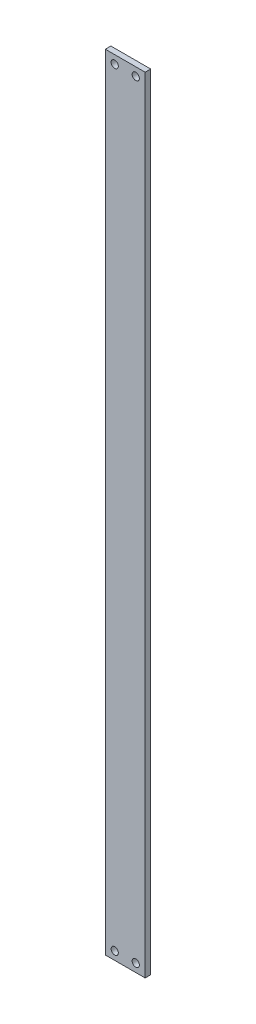
ISO-10303-21;
HEADER;
FILE_DESCRIPTION(('STEP AP214'),'2;1');
FILE_NAME('part.step','',(''),(''),'','','');
FILE_SCHEMA(('AUTOMOTIVE_DESIGN { 1 0 10303 214 1 1 1 1 }'));
ENDSEC;
DATA;
#1=APPLICATION_CONTEXT('core data for automotive mechanical design processes');
#2=APPLICATION_PROTOCOL_DEFINITION('international standard','automotive_design',2000,#1);
#3=PRODUCT_CONTEXT('',#1,'mechanical');
#4=PRODUCT('Part','Part','',(#3));
#5=PRODUCT_RELATED_PRODUCT_CATEGORY('part','',(#4));
#6=PRODUCT_DEFINITION_FORMATION('','',#4);
#7=PRODUCT_DEFINITION_CONTEXT('part definition',#1,'design');
#8=PRODUCT_DEFINITION('design','',#6,#7);
#9=PRODUCT_DEFINITION_SHAPE('','',#8);
#10=(LENGTH_UNIT() NAMED_UNIT(*) SI_UNIT(.MILLI.,.METRE.));
#11=(NAMED_UNIT(*) PLANE_ANGLE_UNIT() SI_UNIT($,.RADIAN.));
#12=(NAMED_UNIT(*) SI_UNIT($,.STERADIAN.) SOLID_ANGLE_UNIT());
#13=UNCERTAINTY_MEASURE_WITH_UNIT(LENGTH_MEASURE(1.E-05),#10,'distance_accuracy_value','');
#14=(GEOMETRIC_REPRESENTATION_CONTEXT(3) GLOBAL_UNCERTAINTY_ASSIGNED_CONTEXT((#13)) GLOBAL_UNIT_ASSIGNED_CONTEXT((#10,
#11,#12)) REPRESENTATION_CONTEXT('',''));
#15=CARTESIAN_POINT('',(0.,0.,0.));
#16=DIRECTION('',(0.,0.,1.));
#17=DIRECTION('',(1.,0.,0.));
#18=AXIS2_PLACEMENT_3D('',#15,#16,#17);
#19=CARTESIAN_POINT('',(-38.5,-197.5,0.));
#20=DIRECTION('',(0.,-1.,0.));
#21=DIRECTION('',(0.,0.,-1.));
#22=AXIS2_PLACEMENT_3D('',#19,#20,#21);
#23=PLANE('',#22);
#24=DIRECTION('',(1.,0.,0.));
#25=VECTOR('',#24,1.);
#26=CARTESIAN_POINT('',(-38.5,-197.5,5.));
#27=LINE('',#26,#25);
#28=CARTESIAN_POINT('',(-38.5,-197.5,5.));
#29=VERTEX_POINT('',#28);
#30=CARTESIAN_POINT('',(-2.5,-197.5,5.));
#31=VERTEX_POINT('',#30);
#32=EDGE_CURVE('E98',#29,#31,#27,.T.);
#33=ORIENTED_EDGE('',*,*,#32,.F.);
#34=DIRECTION('',(0.,0.,1.));
#35=VECTOR('',#34,1.);
#36=CARTESIAN_POINT('',(-38.5,-197.5,0.));
#37=LINE('',#36,#35);
#38=CARTESIAN_POINT('',(-38.5,-197.5,0.));
#39=VERTEX_POINT('',#38);
#40=EDGE_CURVE('E11',#39,#29,#37,.T.);
#41=ORIENTED_EDGE('',*,*,#40,.F.);
#42=DIRECTION('',(1.,0.,0.));
#43=VECTOR('',#42,1.);
#44=CARTESIAN_POINT('',(-38.5,-197.5,0.));
#45=LINE('',#44,#43);
#46=CARTESIAN_POINT('',(-2.5,-197.5,0.));
#47=VERTEX_POINT('',#46);
#48=EDGE_CURVE('E91',#39,#47,#45,.T.);
#49=ORIENTED_EDGE('',*,*,#48,.T.);
#50=DIRECTION('',(0.,0.,1.));
#51=VECTOR('',#50,1.);
#52=CARTESIAN_POINT('',(-2.5,-197.5,0.));
#53=LINE('',#52,#51);
#54=EDGE_CURVE('E36',#47,#31,#53,.T.);
#55=ORIENTED_EDGE('',*,*,#54,.T.);
#56=EDGE_LOOP('',(#33,#41,#49,#55));
#57=FACE_BOUND('',#56,.T.);
#58=ADVANCED_FACE('F33',(#57),#23,.T.);
#59=CARTESIAN_POINT('',(-38.5000000000001,511.5,0.));
#60=DIRECTION('',(-1.,0.,0.));
#61=DIRECTION('',(0.,-1.,0.));
#62=AXIS2_PLACEMENT_3D('',#59,#60,#61);
#63=PLANE('',#62);
#64=DIRECTION('',(0.,-1.,0.));
#65=VECTOR('',#64,1.);
#66=CARTESIAN_POINT('',(-38.5000000000001,511.5,5.));
#67=LINE('',#66,#65);
#68=CARTESIAN_POINT('',(-38.5000000000001,511.5,5.));
#69=VERTEX_POINT('',#68);
#70=EDGE_CURVE('E93',#69,#29,#67,.T.);
#71=ORIENTED_EDGE('',*,*,#70,.F.);
#72=DIRECTION('',(0.,0.,1.));
#73=VECTOR('',#72,1.);
#74=CARTESIAN_POINT('',(-38.5000000000001,511.5,0.));
#75=LINE('',#74,#73);
#76=CARTESIAN_POINT('',(-38.5000000000001,511.5,0.));
#77=VERTEX_POINT('',#76);
#78=EDGE_CURVE('E42',#77,#69,#75,.T.);
#79=ORIENTED_EDGE('',*,*,#78,.F.);
#80=DIRECTION('',(0.,-1.,0.));
#81=VECTOR('',#80,1.);
#82=CARTESIAN_POINT('',(-38.5000000000001,511.5,0.));
#83=LINE('',#82,#81);
#84=EDGE_CURVE('E88',#77,#39,#83,.T.);
#85=ORIENTED_EDGE('',*,*,#84,.T.);
#86=ORIENTED_EDGE('',*,*,#40,.T.);
#87=EDGE_LOOP('',(#71,#79,#85,#86));
#88=FACE_BOUND('',#87,.T.);
#89=ADVANCED_FACE('F109',(#88),#63,.T.);
#90=CARTESIAN_POINT('',(-2.5,511.5,0.));
#91=DIRECTION('',(0.,1.,0.));
#92=DIRECTION('',(0.,0.,1.));
#93=AXIS2_PLACEMENT_3D('',#90,#91,#92);
#94=PLANE('',#93);
#95=DIRECTION('',(-1.,0.,0.));
#96=VECTOR('',#95,1.);
#97=CARTESIAN_POINT('',(-2.5,511.5,5.));
#98=LINE('',#97,#96);
#99=CARTESIAN_POINT('',(-2.5,511.5,5.));
#100=VERTEX_POINT('',#99);
#101=EDGE_CURVE('E83',#100,#69,#98,.T.);
#102=ORIENTED_EDGE('',*,*,#101,.F.);
#103=DIRECTION('',(0.,0.,1.));
#104=VECTOR('',#103,1.);
#105=CARTESIAN_POINT('',(-2.5,511.5,0.));
#106=LINE('',#105,#104);
#107=CARTESIAN_POINT('',(-2.5,511.5,0.));
#108=VERTEX_POINT('',#107);
#109=EDGE_CURVE('E78',#108,#100,#106,.T.);
#110=ORIENTED_EDGE('',*,*,#109,.F.);
#111=DIRECTION('',(-1.,0.,0.));
#112=VECTOR('',#111,1.);
#113=CARTESIAN_POINT('',(-2.5,511.5,0.));
#114=LINE('',#113,#112);
#115=EDGE_CURVE('E81',#108,#77,#114,.T.);
#116=ORIENTED_EDGE('',*,*,#115,.T.);
#117=ORIENTED_EDGE('',*,*,#78,.T.);
#118=EDGE_LOOP('',(#102,#110,#116,#117));
#119=FACE_BOUND('',#118,.T.);
#120=ADVANCED_FACE('F80',(#119),#94,.T.);
#121=CARTESIAN_POINT('',(-2.5,-197.5,0.));
#122=DIRECTION('',(1.,0.,0.));
#123=DIRECTION('',(0.,0.,-1.));
#124=AXIS2_PLACEMENT_3D('',#121,#122,#123);
#125=PLANE('',#124);
#126=DIRECTION('',(0.,1.,0.));
#127=VECTOR('',#126,1.);
#128=CARTESIAN_POINT('',(-2.5,-197.5,5.));
#129=LINE('',#128,#127);
#130=EDGE_CURVE('E101',#31,#100,#129,.T.);
#131=ORIENTED_EDGE('',*,*,#130,.F.);
#132=ORIENTED_EDGE('',*,*,#54,.F.);
#133=DIRECTION('',(0.,1.,0.));
#134=VECTOR('',#133,1.);
#135=CARTESIAN_POINT('',(-2.5,-197.5,0.));
#136=LINE('',#135,#134);
#137=EDGE_CURVE('E87',#47,#108,#136,.T.);
#138=ORIENTED_EDGE('',*,*,#137,.T.);
#139=ORIENTED_EDGE('',*,*,#109,.T.);
#140=EDGE_LOOP('',(#131,#132,#138,#139));
#141=FACE_BOUND('',#140,.T.);
#142=ADVANCED_FACE('F90',(#141),#125,.T.);
#143=CARTESIAN_POINT('',(0.,0.,0.));
#144=DIRECTION('',(0.,0.,1.));
#145=DIRECTION('',(1.,0.,0.));
#146=AXIS2_PLACEMENT_3D('',#143,#144,#145);
#147=PLANE('',#146);
#148=CARTESIAN_POINT('',(-11.,-190.,0.));
#149=DIRECTION('',(0.,0.,1.));
#150=DIRECTION('',(-1.,0.,0.));
#151=AXIS2_PLACEMENT_3D('',#148,#149,#150);
#152=CIRCLE('',#151,3.25);
#153=CARTESIAN_POINT('',(-14.25,-190.,0.));
#154=VERTEX_POINT('',#153);
#155=EDGE_CURVE('E150',#154,#154,#152,.T.);
#156=ORIENTED_EDGE('',*,*,#155,.T.);
#157=EDGE_LOOP('',(#156));
#158=FACE_BOUND('',#157,.T.);
#159=CARTESIAN_POINT('',(-11.,504.,0.));
#160=DIRECTION('',(0.,0.,1.));
#161=DIRECTION('',(-1.,0.,0.));
#162=AXIS2_PLACEMENT_3D('',#159,#160,#161);
#163=CIRCLE('',#162,3.24999999999995);
#164=CARTESIAN_POINT('',(-14.25,504.,0.));
#165=VERTEX_POINT('',#164);
#166=EDGE_CURVE('E158',#165,#165,#163,.T.);
#167=ORIENTED_EDGE('',*,*,#166,.T.);
#168=EDGE_LOOP('',(#167));
#169=FACE_BOUND('',#168,.T.);
#170=CARTESIAN_POINT('',(-30.0000000000001,504.,0.));
#171=DIRECTION('',(0.,0.,1.));
#172=DIRECTION('',(-1.,0.,0.));
#173=AXIS2_PLACEMENT_3D('',#170,#171,#172);
#174=CIRCLE('',#173,3.24999999999995);
#175=CARTESIAN_POINT('',(-33.25,504.,0.));
#176=VERTEX_POINT('',#175);
#177=EDGE_CURVE('E164',#176,#176,#174,.T.);
#178=ORIENTED_EDGE('',*,*,#177,.T.);
#179=EDGE_LOOP('',(#178));
#180=FACE_BOUND('',#179,.T.);
#181=CARTESIAN_POINT('',(-30.,-190.,0.));
#182=DIRECTION('',(0.,0.,1.));
#183=DIRECTION('',(-1.,0.,0.));
#184=AXIS2_PLACEMENT_3D('',#181,#182,#183);
#185=CIRCLE('',#184,3.25);
#186=CARTESIAN_POINT('',(-33.25,-190.,0.));
#187=VERTEX_POINT('',#186);
#188=EDGE_CURVE('E102',#187,#187,#185,.T.);
#189=ORIENTED_EDGE('',*,*,#188,.T.);
#190=EDGE_LOOP('',(#189));
#191=FACE_BOUND('',#190,.T.);
#192=ORIENTED_EDGE('',*,*,#48,.F.);
#193=ORIENTED_EDGE('',*,*,#84,.F.);
#194=ORIENTED_EDGE('',*,*,#115,.F.);
#195=ORIENTED_EDGE('',*,*,#137,.F.);
#196=EDGE_LOOP('',(#192,#193,#194,#195));
#197=FACE_BOUND('',#196,.T.);
#198=ADVANCED_FACE('F86',(#158,#169,#180,#191,#197),#147,.F.);
#199=CARTESIAN_POINT('',(0.,0.,5.));
#200=DIRECTION('',(0.,0.,1.));
#201=DIRECTION('',(1.,0.,0.));
#202=AXIS2_PLACEMENT_3D('',#199,#200,#201);
#203=PLANE('',#202);
#204=CARTESIAN_POINT('',(-11.,-190.,5.));
#205=DIRECTION('',(0.,0.,1.));
#206=DIRECTION('',(-1.,0.,0.));
#207=AXIS2_PLACEMENT_3D('',#204,#205,#206);
#208=CIRCLE('',#207,3.25);
#209=CARTESIAN_POINT('',(-14.25,-190.,5.));
#210=VERTEX_POINT('',#209);
#211=EDGE_CURVE('E153',#210,#210,#208,.T.);
#212=ORIENTED_EDGE('',*,*,#211,.F.);
#213=EDGE_LOOP('',(#212));
#214=FACE_BOUND('',#213,.T.);
#215=CARTESIAN_POINT('',(-11.,504.,5.));
#216=DIRECTION('',(0.,0.,1.));
#217=DIRECTION('',(-1.,0.,0.));
#218=AXIS2_PLACEMENT_3D('',#215,#216,#217);
#219=CIRCLE('',#218,3.24999999999995);
#220=CARTESIAN_POINT('',(-14.25,504.,5.));
#221=VERTEX_POINT('',#220);
#222=EDGE_CURVE('E155',#221,#221,#219,.T.);
#223=ORIENTED_EDGE('',*,*,#222,.F.);
#224=EDGE_LOOP('',(#223));
#225=FACE_BOUND('',#224,.T.);
#226=CARTESIAN_POINT('',(-30.0000000000001,504.,5.));
#227=DIRECTION('',(0.,0.,1.));
#228=DIRECTION('',(-1.,0.,0.));
#229=AXIS2_PLACEMENT_3D('',#226,#227,#228);
#230=CIRCLE('',#229,3.24999999999995);
#231=CARTESIAN_POINT('',(-33.25,504.,5.));
#232=VERTEX_POINT('',#231);
#233=EDGE_CURVE('E161',#232,#232,#230,.T.);
#234=ORIENTED_EDGE('',*,*,#233,.F.);
#235=EDGE_LOOP('',(#234));
#236=FACE_BOUND('',#235,.T.);
#237=CARTESIAN_POINT('',(-30.,-190.,5.));
#238=DIRECTION('',(0.,0.,1.));
#239=DIRECTION('',(-1.,0.,0.));
#240=AXIS2_PLACEMENT_3D('',#237,#238,#239);
#241=CIRCLE('',#240,3.25);
#242=CARTESIAN_POINT('',(-33.25,-190.,5.));
#243=VERTEX_POINT('',#242);
#244=EDGE_CURVE('E167',#243,#243,#241,.T.);
#245=ORIENTED_EDGE('',*,*,#244,.F.);
#246=EDGE_LOOP('',(#245));
#247=FACE_BOUND('',#246,.T.);
#248=ORIENTED_EDGE('',*,*,#32,.T.);
#249=ORIENTED_EDGE('',*,*,#130,.T.);
#250=ORIENTED_EDGE('',*,*,#101,.T.);
#251=ORIENTED_EDGE('',*,*,#70,.T.);
#252=EDGE_LOOP('',(#248,#249,#250,#251));
#253=FACE_BOUND('',#252,.T.);
#254=ADVANCED_FACE('F108',(#214,#225,#236,#247,#253),#203,.T.);
#255=CARTESIAN_POINT('',(-30.,-190.,0.));
#256=DIRECTION('',(0.,0.,1.));
#257=DIRECTION('',(1.,0.,0.));
#258=AXIS2_PLACEMENT_3D('',#255,#256,#257);
#259=CYLINDRICAL_SURFACE('',#258,3.25);
#260=ORIENTED_EDGE('',*,*,#188,.F.);
#261=EDGE_LOOP('',(#260));
#262=FACE_BOUND('',#261,.T.);
#263=ORIENTED_EDGE('',*,*,#244,.T.);
#264=EDGE_LOOP('',(#263));
#265=FACE_BOUND('',#264,.T.);
#266=ADVANCED_FACE('F127',(#262,#265),#259,.F.);
#267=CARTESIAN_POINT('',(-30.0000000000001,504.,0.));
#268=DIRECTION('',(0.,0.,1.));
#269=DIRECTION('',(1.,0.,0.));
#270=AXIS2_PLACEMENT_3D('',#267,#268,#269);
#271=CYLINDRICAL_SURFACE('',#270,3.24999999999995);
#272=ORIENTED_EDGE('',*,*,#177,.F.);
#273=EDGE_LOOP('',(#272));
#274=FACE_BOUND('',#273,.T.);
#275=ORIENTED_EDGE('',*,*,#233,.T.);
#276=EDGE_LOOP('',(#275));
#277=FACE_BOUND('',#276,.T.);
#278=ADVANCED_FACE('F134',(#274,#277),#271,.F.);
#279=CARTESIAN_POINT('',(-11.,504.,0.));
#280=DIRECTION('',(0.,0.,1.));
#281=DIRECTION('',(1.,0.,0.));
#282=AXIS2_PLACEMENT_3D('',#279,#280,#281);
#283=CYLINDRICAL_SURFACE('',#282,3.24999999999995);
#284=ORIENTED_EDGE('',*,*,#166,.F.);
#285=EDGE_LOOP('',(#284));
#286=FACE_BOUND('',#285,.T.);
#287=ORIENTED_EDGE('',*,*,#222,.T.);
#288=EDGE_LOOP('',(#287));
#289=FACE_BOUND('',#288,.T.);
#290=ADVANCED_FACE('F138',(#286,#289),#283,.F.);
#291=CARTESIAN_POINT('',(-11.,-190.,0.));
#292=DIRECTION('',(0.,0.,1.));
#293=DIRECTION('',(1.,0.,0.));
#294=AXIS2_PLACEMENT_3D('',#291,#292,#293);
#295=CYLINDRICAL_SURFACE('',#294,3.25);
#296=ORIENTED_EDGE('',*,*,#155,.F.);
#297=EDGE_LOOP('',(#296));
#298=FACE_BOUND('',#297,.T.);
#299=ORIENTED_EDGE('',*,*,#211,.T.);
#300=EDGE_LOOP('',(#299));
#301=FACE_BOUND('',#300,.T.);
#302=ADVANCED_FACE('F142',(#298,#301),#295,.F.);
#303=CLOSED_SHELL('',(#58,#89,#120,#142,#198,#254,#266,#278,#290,#302));
#304=MANIFOLD_SOLID_BREP('B2',#303);
#305=ADVANCED_BREP_SHAPE_REPRESENTATION('',(#18,#304),#14);
#306=SHAPE_DEFINITION_REPRESENTATION(#9,#305);
ENDSEC;
END-ISO-10303-21;
